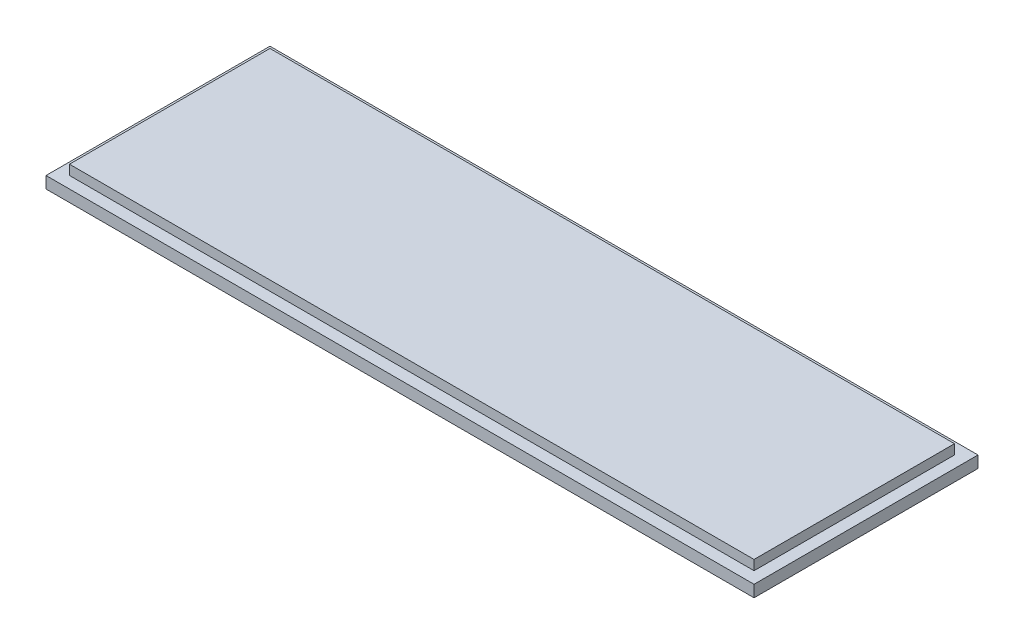
ISO-10303-21;
HEADER;
FILE_DESCRIPTION(('STEP AP214'),'2;1');
FILE_NAME('part.step','',(''),(''),'','','');
FILE_SCHEMA(('AUTOMOTIVE_DESIGN { 1 0 10303 214 1 1 1 1 }'));
ENDSEC;
DATA;
#1=APPLICATION_CONTEXT('core data for automotive mechanical design processes');
#2=APPLICATION_PROTOCOL_DEFINITION('international standard','automotive_design',2000,#1);
#3=PRODUCT_CONTEXT('',#1,'mechanical');
#4=PRODUCT('Part','Part','',(#3));
#5=PRODUCT_RELATED_PRODUCT_CATEGORY('part','',(#4));
#6=PRODUCT_DEFINITION_FORMATION('','',#4);
#7=PRODUCT_DEFINITION_CONTEXT('part definition',#1,'design');
#8=PRODUCT_DEFINITION('design','',#6,#7);
#9=PRODUCT_DEFINITION_SHAPE('','',#8);
#10=(LENGTH_UNIT() NAMED_UNIT(*) SI_UNIT(.MILLI.,.METRE.));
#11=(NAMED_UNIT(*) PLANE_ANGLE_UNIT() SI_UNIT($,.RADIAN.));
#12=(NAMED_UNIT(*) SI_UNIT($,.STERADIAN.) SOLID_ANGLE_UNIT());
#13=UNCERTAINTY_MEASURE_WITH_UNIT(LENGTH_MEASURE(1.E-05),#10,'distance_accuracy_value','');
#14=(GEOMETRIC_REPRESENTATION_CONTEXT(3) GLOBAL_UNCERTAINTY_ASSIGNED_CONTEXT((#13)) GLOBAL_UNIT_ASSIGNED_CONTEXT((#10,
#11,#12)) REPRESENTATION_CONTEXT('',''));
#15=CARTESIAN_POINT('',(0.,0.,0.));
#16=DIRECTION('',(0.,0.,1.));
#17=DIRECTION('',(1.,0.,0.));
#18=AXIS2_PLACEMENT_3D('',#15,#16,#17);
#19=CARTESIAN_POINT('',(0.,1.2,0.));
#20=DIRECTION('',(0.,-1.,0.));
#21=DIRECTION('',(0.,0.,-1.));
#22=AXIS2_PLACEMENT_3D('',#19,#20,#21);
#23=PLANE('',#22);
#24=DIRECTION('',(0.,0.,1.));
#25=VECTOR('',#24,1.);
#26=CARTESIAN_POINT('',(0.,1.2,0.));
#27=LINE('',#26,#25);
#28=CARTESIAN_POINT('',(0.,1.2,-22.9));
#29=VERTEX_POINT('',#28);
#30=CARTESIAN_POINT('',(0.,1.2,0.));
#31=VERTEX_POINT('',#30);
#32=EDGE_CURVE('E139',#29,#31,#27,.T.);
#33=ORIENTED_EDGE('',*,*,#32,.T.);
#34=DIRECTION('',(1.,0.,0.));
#35=VECTOR('',#34,1.);
#36=CARTESIAN_POINT('',(0.,1.2,0.));
#37=LINE('',#36,#35);
#38=CARTESIAN_POINT('',(72.4,1.2,0.));
#39=VERTEX_POINT('',#38);
#40=EDGE_CURVE('E143',#31,#39,#37,.T.);
#41=ORIENTED_EDGE('',*,*,#40,.T.);
#42=DIRECTION('',(0.,0.,-1.));
#43=VECTOR('',#42,1.);
#44=CARTESIAN_POINT('',(72.4,1.2,0.));
#45=LINE('',#44,#43);
#46=CARTESIAN_POINT('',(72.4,1.2,-22.9));
#47=VERTEX_POINT('',#46);
#48=EDGE_CURVE('E147',#39,#47,#45,.T.);
#49=ORIENTED_EDGE('',*,*,#48,.T.);
#50=DIRECTION('',(-1.,0.,0.));
#51=VECTOR('',#50,1.);
#52=CARTESIAN_POINT('',(0.,1.2,-22.9));
#53=LINE('',#52,#51);
#54=EDGE_CURVE('E150',#47,#29,#53,.T.);
#55=ORIENTED_EDGE('',*,*,#54,.T.);
#56=EDGE_LOOP('',(#33,#41,#49,#55));
#57=FACE_BOUND('',#56,.T.);
#58=DIRECTION('',(0.,0.,1.));
#59=VECTOR('',#58,1.);
#60=CARTESIAN_POINT('',(1.2,1.2,-21.7));
#61=LINE('',#60,#59);
#62=CARTESIAN_POINT('',(1.2,1.2,-21.7));
#63=VERTEX_POINT('',#62);
#64=CARTESIAN_POINT('',(1.2,1.2,-1.2));
#65=VERTEX_POINT('',#64);
#66=EDGE_CURVE('E55',#63,#65,#61,.T.);
#67=ORIENTED_EDGE('',*,*,#66,.F.);
#68=DIRECTION('',(-1.,0.,0.));
#69=VECTOR('',#68,1.);
#70=CARTESIAN_POINT('',(1.2,1.2,-21.7));
#71=LINE('',#70,#69);
#72=CARTESIAN_POINT('',(71.2,1.2,-21.7));
#73=VERTEX_POINT('',#72);
#74=EDGE_CURVE('E59',#73,#63,#71,.T.);
#75=ORIENTED_EDGE('',*,*,#74,.F.);
#76=DIRECTION('',(0.,0.,-1.));
#77=VECTOR('',#76,1.);
#78=CARTESIAN_POINT('',(71.2,1.2,-21.7));
#79=LINE('',#78,#77);
#80=CARTESIAN_POINT('',(71.2,1.2,-1.2));
#81=VERTEX_POINT('',#80);
#82=EDGE_CURVE('E283',#81,#73,#79,.T.);
#83=ORIENTED_EDGE('',*,*,#82,.F.);
#84=DIRECTION('',(1.,0.,0.));
#85=VECTOR('',#84,1.);
#86=CARTESIAN_POINT('',(1.2,1.2,-1.2));
#87=LINE('',#86,#85);
#88=EDGE_CURVE('E293',#65,#81,#87,.T.);
#89=ORIENTED_EDGE('',*,*,#88,.F.);
#90=EDGE_LOOP('',(#67,#75,#83,#89));
#91=FACE_BOUND('',#90,.T.);
#92=ADVANCED_FACE('F39',(#57,#91),#23,.F.);
#93=CARTESIAN_POINT('',(0.,1.2,0.));
#94=DIRECTION('',(1.,0.,0.));
#95=DIRECTION('',(0.,0.,-1.));
#96=AXIS2_PLACEMENT_3D('',#93,#94,#95);
#97=PLANE('',#96);
#98=DIRECTION('',(0.,0.,1.));
#99=VECTOR('',#98,1.);
#100=CARTESIAN_POINT('',(0.,0.,0.));
#101=LINE('',#100,#99);
#102=CARTESIAN_POINT('',(0.,0.,-22.9));
#103=VERTEX_POINT('',#102);
#104=CARTESIAN_POINT('',(0.,0.,0.));
#105=VERTEX_POINT('',#104);
#106=EDGE_CURVE('E128',#103,#105,#101,.T.);
#107=ORIENTED_EDGE('',*,*,#106,.T.);
#108=DIRECTION('',(0.,-1.,0.));
#109=VECTOR('',#108,1.);
#110=CARTESIAN_POINT('',(0.,1.2,0.));
#111=LINE('',#110,#109);
#112=EDGE_CURVE('E11',#31,#105,#111,.T.);
#113=ORIENTED_EDGE('',*,*,#112,.F.);
#114=ORIENTED_EDGE('',*,*,#32,.F.);
#115=DIRECTION('',(0.,-1.,0.));
#116=VECTOR('',#115,1.);
#117=CARTESIAN_POINT('',(0.,1.2,-22.9));
#118=LINE('',#117,#116);
#119=EDGE_CURVE('E152',#29,#103,#118,.T.);
#120=ORIENTED_EDGE('',*,*,#119,.T.);
#121=EDGE_LOOP('',(#107,#113,#114,#120));
#122=FACE_BOUND('',#121,.T.);
#123=ADVANCED_FACE('F41',(#122),#97,.F.);
#124=CARTESIAN_POINT('',(0.,1.2,0.));
#125=DIRECTION('',(0.,0.,-1.));
#126=DIRECTION('',(-1.,0.,0.));
#127=AXIS2_PLACEMENT_3D('',#124,#125,#126);
#128=PLANE('',#127);
#129=DIRECTION('',(1.,0.,0.));
#130=VECTOR('',#129,1.);
#131=CARTESIAN_POINT('',(0.,0.,0.));
#132=LINE('',#131,#130);
#133=CARTESIAN_POINT('',(72.4,0.,0.));
#134=VERTEX_POINT('',#133);
#135=EDGE_CURVE('E133',#105,#134,#132,.T.);
#136=ORIENTED_EDGE('',*,*,#135,.T.);
#137=DIRECTION('',(0.,-1.,0.));
#138=VECTOR('',#137,1.);
#139=CARTESIAN_POINT('',(72.4,1.2,0.));
#140=LINE('',#139,#138);
#141=EDGE_CURVE('E48',#39,#134,#140,.T.);
#142=ORIENTED_EDGE('',*,*,#141,.F.);
#143=ORIENTED_EDGE('',*,*,#40,.F.);
#144=ORIENTED_EDGE('',*,*,#112,.T.);
#145=EDGE_LOOP('',(#136,#142,#143,#144));
#146=FACE_BOUND('',#145,.T.);
#147=ADVANCED_FACE('F188',(#146),#128,.F.);
#148=CARTESIAN_POINT('',(72.4,1.2,0.));
#149=DIRECTION('',(-1.,0.,0.));
#150=DIRECTION('',(0.,0.,1.));
#151=AXIS2_PLACEMENT_3D('',#148,#149,#150);
#152=PLANE('',#151);
#153=DIRECTION('',(0.,0.,-1.));
#154=VECTOR('',#153,1.);
#155=CARTESIAN_POINT('',(72.4,0.,0.));
#156=LINE('',#155,#154);
#157=CARTESIAN_POINT('',(72.4,0.,-22.9));
#158=VERTEX_POINT('',#157);
#159=EDGE_CURVE('E156',#134,#158,#156,.T.);
#160=ORIENTED_EDGE('',*,*,#159,.T.);
#161=DIRECTION('',(0.,-1.,0.));
#162=VECTOR('',#161,1.);
#163=CARTESIAN_POINT('',(72.4,1.2,-22.9));
#164=LINE('',#163,#162);
#165=EDGE_CURVE('E164',#47,#158,#164,.T.);
#166=ORIENTED_EDGE('',*,*,#165,.F.);
#167=ORIENTED_EDGE('',*,*,#48,.F.);
#168=ORIENTED_EDGE('',*,*,#141,.T.);
#169=EDGE_LOOP('',(#160,#166,#167,#168));
#170=FACE_BOUND('',#169,.T.);
#171=ADVANCED_FACE('F173',(#170),#152,.F.);
#172=CARTESIAN_POINT('',(0.,1.2,-22.9));
#173=DIRECTION('',(0.,0.,1.));
#174=DIRECTION('',(1.,0.,0.));
#175=AXIS2_PLACEMENT_3D('',#172,#173,#174);
#176=PLANE('',#175);
#177=DIRECTION('',(-1.,0.,0.));
#178=VECTOR('',#177,1.);
#179=CARTESIAN_POINT('',(0.,0.,-22.9));
#180=LINE('',#179,#178);
#181=EDGE_CURVE('E144',#158,#103,#180,.T.);
#182=ORIENTED_EDGE('',*,*,#181,.T.);
#183=ORIENTED_EDGE('',*,*,#119,.F.);
#184=ORIENTED_EDGE('',*,*,#54,.F.);
#185=ORIENTED_EDGE('',*,*,#165,.T.);
#186=EDGE_LOOP('',(#182,#183,#184,#185));
#187=FACE_BOUND('',#186,.T.);
#188=ADVANCED_FACE('F182',(#187),#176,.F.);
#189=CARTESIAN_POINT('',(0.,0.,0.));
#190=DIRECTION('',(0.,-1.,0.));
#191=DIRECTION('',(0.,0.,-1.));
#192=AXIS2_PLACEMENT_3D('',#189,#190,#191);
#193=PLANE('',#192);
#194=ORIENTED_EDGE('',*,*,#106,.F.);
#195=ORIENTED_EDGE('',*,*,#181,.F.);
#196=ORIENTED_EDGE('',*,*,#159,.F.);
#197=ORIENTED_EDGE('',*,*,#135,.F.);
#198=EDGE_LOOP('',(#194,#195,#196,#197));
#199=FACE_BOUND('',#198,.T.);
#200=ADVANCED_FACE('F179',(#199),#193,.T.);
#201=CARTESIAN_POINT('',(1.2,2.2,-21.7));
#202=DIRECTION('',(1.,0.,0.));
#203=DIRECTION('',(0.,0.,-1.));
#204=AXIS2_PLACEMENT_3D('',#201,#202,#203);
#205=PLANE('',#204);
#206=ORIENTED_EDGE('',*,*,#66,.T.);
#207=DIRECTION('',(0.,-1.,0.));
#208=VECTOR('',#207,1.);
#209=CARTESIAN_POINT('',(1.2,2.2,-1.2));
#210=LINE('',#209,#208);
#211=CARTESIAN_POINT('',(1.2,2.2,-1.2));
#212=VERTEX_POINT('',#211);
#213=EDGE_CURVE('E108',#212,#65,#210,.T.);
#214=ORIENTED_EDGE('',*,*,#213,.F.);
#215=DIRECTION('',(0.,0.,1.));
#216=VECTOR('',#215,1.);
#217=CARTESIAN_POINT('',(1.2,2.2,-21.7));
#218=LINE('',#217,#216);
#219=CARTESIAN_POINT('',(1.2,2.2,-21.7));
#220=VERTEX_POINT('',#219);
#221=EDGE_CURVE('E115',#220,#212,#218,.T.);
#222=ORIENTED_EDGE('',*,*,#221,.F.);
#223=DIRECTION('',(0.,-1.,0.));
#224=VECTOR('',#223,1.);
#225=CARTESIAN_POINT('',(1.2,2.2,-21.7));
#226=LINE('',#225,#224);
#227=EDGE_CURVE('E280',#220,#63,#226,.T.);
#228=ORIENTED_EDGE('',*,*,#227,.T.);
#229=EDGE_LOOP('',(#206,#214,#222,#228));
#230=FACE_BOUND('',#229,.T.);
#231=ADVANCED_FACE('F126',(#230),#205,.F.);
#232=CARTESIAN_POINT('',(1.2,2.2,-1.2));
#233=DIRECTION('',(0.,0.,-1.));
#234=DIRECTION('',(-1.,0.,0.));
#235=AXIS2_PLACEMENT_3D('',#232,#233,#234);
#236=PLANE('',#235);
#237=ORIENTED_EDGE('',*,*,#88,.T.);
#238=DIRECTION('',(0.,-1.,0.));
#239=VECTOR('',#238,1.);
#240=CARTESIAN_POINT('',(71.2,2.2,-1.2));
#241=LINE('',#240,#239);
#242=CARTESIAN_POINT('',(71.2,2.2,-1.2));
#243=VERTEX_POINT('',#242);
#244=EDGE_CURVE('E110',#243,#81,#241,.T.);
#245=ORIENTED_EDGE('',*,*,#244,.F.);
#246=DIRECTION('',(1.,0.,0.));
#247=VECTOR('',#246,1.);
#248=CARTESIAN_POINT('',(1.2,2.2,-1.2));
#249=LINE('',#248,#247);
#250=EDGE_CURVE('E103',#212,#243,#249,.T.);
#251=ORIENTED_EDGE('',*,*,#250,.F.);
#252=ORIENTED_EDGE('',*,*,#213,.T.);
#253=EDGE_LOOP('',(#237,#245,#251,#252));
#254=FACE_BOUND('',#253,.T.);
#255=ADVANCED_FACE('F106',(#254),#236,.F.);
#256=CARTESIAN_POINT('',(71.2,2.2,-21.7));
#257=DIRECTION('',(-1.,0.,0.));
#258=DIRECTION('',(0.,0.,1.));
#259=AXIS2_PLACEMENT_3D('',#256,#257,#258);
#260=PLANE('',#259);
#261=ORIENTED_EDGE('',*,*,#82,.T.);
#262=DIRECTION('',(0.,-1.,0.));
#263=VECTOR('',#262,1.);
#264=CARTESIAN_POINT('',(71.2,2.2,-21.7));
#265=LINE('',#264,#263);
#266=CARTESIAN_POINT('',(71.2,2.2,-21.7));
#267=VERTEX_POINT('',#266);
#268=EDGE_CURVE('E135',#267,#73,#265,.T.);
#269=ORIENTED_EDGE('',*,*,#268,.F.);
#270=DIRECTION('',(0.,0.,-1.));
#271=VECTOR('',#270,1.);
#272=CARTESIAN_POINT('',(71.2,2.2,-21.7));
#273=LINE('',#272,#271);
#274=EDGE_CURVE('E114',#243,#267,#273,.T.);
#275=ORIENTED_EDGE('',*,*,#274,.F.);
#276=ORIENTED_EDGE('',*,*,#244,.T.);
#277=EDGE_LOOP('',(#261,#269,#275,#276));
#278=FACE_BOUND('',#277,.T.);
#279=ADVANCED_FACE('F224',(#278),#260,.F.);
#280=CARTESIAN_POINT('',(1.2,2.2,-21.7));
#281=DIRECTION('',(0.,0.,1.));
#282=DIRECTION('',(1.,0.,0.));
#283=AXIS2_PLACEMENT_3D('',#280,#281,#282);
#284=PLANE('',#283);
#285=ORIENTED_EDGE('',*,*,#74,.T.);
#286=ORIENTED_EDGE('',*,*,#227,.F.);
#287=DIRECTION('',(-1.,0.,0.));
#288=VECTOR('',#287,1.);
#289=CARTESIAN_POINT('',(1.2,2.2,-21.7));
#290=LINE('',#289,#288);
#291=EDGE_CURVE('E120',#267,#220,#290,.T.);
#292=ORIENTED_EDGE('',*,*,#291,.F.);
#293=ORIENTED_EDGE('',*,*,#268,.T.);
#294=EDGE_LOOP('',(#285,#286,#292,#293));
#295=FACE_BOUND('',#294,.T.);
#296=ADVANCED_FACE('F230',(#295),#284,.F.);
#297=CARTESIAN_POINT('',(0.,2.2,0.));
#298=DIRECTION('',(0.,1.,0.));
#299=DIRECTION('',(0.,0.,1.));
#300=AXIS2_PLACEMENT_3D('',#297,#298,#299);
#301=PLANE('',#300);
#302=ORIENTED_EDGE('',*,*,#221,.T.);
#303=ORIENTED_EDGE('',*,*,#250,.T.);
#304=ORIENTED_EDGE('',*,*,#274,.T.);
#305=ORIENTED_EDGE('',*,*,#291,.T.);
#306=EDGE_LOOP('',(#302,#303,#304,#305));
#307=FACE_BOUND('',#306,.T.);
#308=ADVANCED_FACE('F118',(#307),#301,.T.);
#309=CLOSED_SHELL('',(#92,#123,#147,#171,#188,#200,#231,#255,#279,#296,#308));
#310=MANIFOLD_SOLID_BREP('B2',#309);
#311=ADVANCED_BREP_SHAPE_REPRESENTATION('',(#18,#310),#14);
#312=SHAPE_DEFINITION_REPRESENTATION(#9,#311);
ENDSEC;
END-ISO-10303-21;
